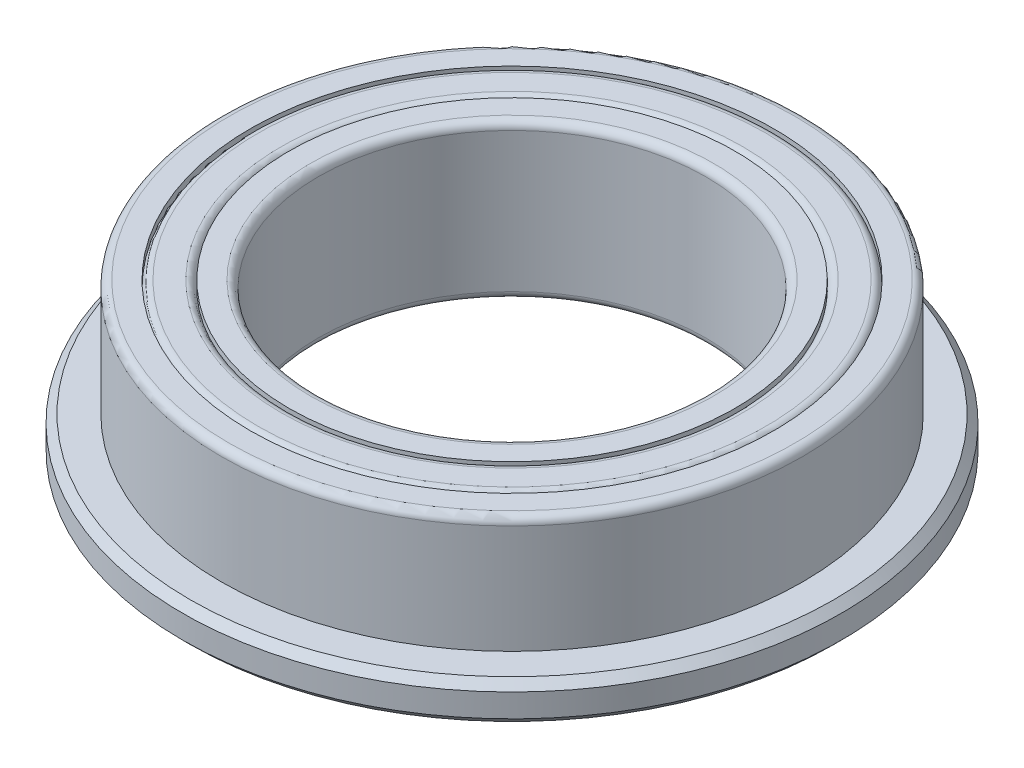
ISO-10303-21;
HEADER;
FILE_DESCRIPTION(('STEP AP214'),'2;1');
FILE_NAME('part.step','',(''),(''),'','','');
FILE_SCHEMA(('AUTOMOTIVE_DESIGN { 1 0 10303 214 1 1 1 1 }'));
ENDSEC;
DATA;
#1=APPLICATION_CONTEXT('core data for automotive mechanical design processes');
#2=APPLICATION_PROTOCOL_DEFINITION('international standard','automotive_design',2000,#1);
#3=PRODUCT_CONTEXT('',#1,'mechanical');
#4=PRODUCT('Part','Part','',(#3));
#5=PRODUCT_RELATED_PRODUCT_CATEGORY('part','',(#4));
#6=PRODUCT_DEFINITION_FORMATION('','',#4);
#7=PRODUCT_DEFINITION_CONTEXT('part definition',#1,'design');
#8=PRODUCT_DEFINITION('design','',#6,#7);
#9=PRODUCT_DEFINITION_SHAPE('','',#8);
#10=(LENGTH_UNIT() NAMED_UNIT(*) SI_UNIT(.MILLI.,.METRE.));
#11=(NAMED_UNIT(*) PLANE_ANGLE_UNIT() SI_UNIT($,.RADIAN.));
#12=(NAMED_UNIT(*) SI_UNIT($,.STERADIAN.) SOLID_ANGLE_UNIT());
#13=UNCERTAINTY_MEASURE_WITH_UNIT(LENGTH_MEASURE(1.E-05),#10,'distance_accuracy_value','');
#14=(GEOMETRIC_REPRESENTATION_CONTEXT(3) GLOBAL_UNCERTAINTY_ASSIGNED_CONTEXT((#13)) GLOBAL_UNIT_ASSIGNED_CONTEXT((#10,
#11,#12)) REPRESENTATION_CONTEXT('',''));
#15=CARTESIAN_POINT('',(0.,0.,0.));
#16=DIRECTION('',(0.,0.,1.));
#17=DIRECTION('',(1.,0.,0.));
#18=AXIS2_PLACEMENT_3D('',#15,#16,#17);
#19=CARTESIAN_POINT('',(0.,1.,0.));
#20=DIRECTION('',(0.,-1.,0.));
#21=DIRECTION('',(0.,0.,-1.));
#22=AXIS2_PLACEMENT_3D('',#19,#20,#21);
#23=CYLINDRICAL_SURFACE('',#22,7.5);
#24=CARTESIAN_POINT('',(0.,1.,0.));
#25=DIRECTION('',(0.,1.,0.));
#26=DIRECTION('',(0.,0.,1.));
#27=AXIS2_PLACEMENT_3D('',#24,#25,#26);
#28=CIRCLE('',#27,7.5);
#29=CARTESIAN_POINT('',(0.,1.,7.5));
#30=VERTEX_POINT('',#29);
#31=EDGE_CURVE('E76',#30,#30,#28,.T.);
#32=ORIENTED_EDGE('',*,*,#31,.T.);
#33=EDGE_LOOP('',(#32));
#34=FACE_BOUND('',#33,.T.);
#35=CARTESIAN_POINT('',(0.,0.,0.));
#36=DIRECTION('',(0.,1.,0.));
#37=DIRECTION('',(0.,0.,1.));
#38=AXIS2_PLACEMENT_3D('',#35,#36,#37);
#39=CIRCLE('',#38,7.5);
#40=CARTESIAN_POINT('',(0.,0.,7.5));
#41=VERTEX_POINT('',#40);
#42=EDGE_CURVE('E77',#41,#41,#39,.T.);
#43=ORIENTED_EDGE('',*,*,#42,.F.);
#44=EDGE_LOOP('',(#43));
#45=FACE_BOUND('',#44,.T.);
#46=ADVANCED_FACE('F55',(#34,#45),#23,.F.);
#47=CARTESIAN_POINT('',(0.,1.,0.));
#48=DIRECTION('',(0.,-1.,0.));
#49=DIRECTION('',(0.,0.,-1.));
#50=AXIS2_PLACEMENT_3D('',#47,#48,#49);
#51=CYLINDRICAL_SURFACE('',#50,8.5);
#52=CARTESIAN_POINT('',(0.,0.800000000000006,0.));
#53=DIRECTION('',(0.,1.,0.));
#54=DIRECTION('',(0.,0.,1.));
#55=AXIS2_PLACEMENT_3D('',#52,#53,#54);
#56=CIRCLE('',#55,8.5);
#57=CARTESIAN_POINT('',(0.,0.800000000000006,-8.5));
#58=VERTEX_POINT('',#57);
#59=EDGE_CURVE('E63',#58,#58,#56,.F.);
#60=ORIENTED_EDGE('',*,*,#59,.T.);
#61=EDGE_LOOP('',(#60));
#62=FACE_BOUND('',#61,.T.);
#63=CARTESIAN_POINT('',(0.,0.200000000000001,0.));
#64=DIRECTION('',(0.,1.,0.));
#65=DIRECTION('',(0.,0.,1.));
#66=AXIS2_PLACEMENT_3D('',#63,#64,#65);
#67=CIRCLE('',#66,8.5);
#68=CARTESIAN_POINT('',(0.,0.200000000000001,8.5));
#69=VERTEX_POINT('',#68);
#70=EDGE_CURVE('E67',#69,#69,#67,.T.);
#71=ORIENTED_EDGE('',*,*,#70,.T.);
#72=EDGE_LOOP('',(#71));
#73=FACE_BOUND('',#72,.T.);
#74=ADVANCED_FACE('F88',(#62,#73),#51,.T.);
#75=CARTESIAN_POINT('',(0.,1.,0.));
#76=DIRECTION('',(0.,1.,0.));
#77=DIRECTION('',(0.,0.,1.));
#78=AXIS2_PLACEMENT_3D('',#75,#76,#77);
#79=PLANE('',#78);
#80=CARTESIAN_POINT('',(0.,1.,0.));
#81=DIRECTION('',(0.,1.,0.));
#82=DIRECTION('',(0.,0.,1.));
#83=AXIS2_PLACEMENT_3D('',#80,#81,#82);
#84=CIRCLE('',#83,8.30000000000001);
#85=CARTESIAN_POINT('',(0.,1.,-8.30000000000001));
#86=VERTEX_POINT('',#85);
#87=EDGE_CURVE('E71',#86,#86,#84,.T.);
#88=ORIENTED_EDGE('',*,*,#87,.T.);
#89=EDGE_LOOP('',(#88));
#90=FACE_BOUND('',#89,.T.);
#91=ORIENTED_EDGE('',*,*,#31,.F.);
#92=EDGE_LOOP('',(#91));
#93=FACE_BOUND('',#92,.T.);
#94=ADVANCED_FACE('F85',(#90,#93),#79,.T.);
#95=CARTESIAN_POINT('',(0.,0.,0.));
#96=DIRECTION('',(0.,1.,0.));
#97=DIRECTION('',(0.,0.,1.));
#98=AXIS2_PLACEMENT_3D('',#95,#96,#97);
#99=PLANE('',#98);
#100=CARTESIAN_POINT('',(0.,0.,0.));
#101=DIRECTION('',(0.,1.,0.));
#102=DIRECTION('',(0.,0.,1.));
#103=AXIS2_PLACEMENT_3D('',#100,#101,#102);
#104=CIRCLE('',#103,8.3);
#105=CARTESIAN_POINT('',(0.,0.,8.3));
#106=VERTEX_POINT('',#105);
#107=EDGE_CURVE('E12',#106,#106,#104,.F.);
#108=ORIENTED_EDGE('',*,*,#107,.T.);
#109=EDGE_LOOP('',(#108));
#110=FACE_BOUND('',#109,.T.);
#111=ORIENTED_EDGE('',*,*,#42,.T.);
#112=EDGE_LOOP('',(#111));
#113=FACE_BOUND('',#112,.T.);
#114=ADVANCED_FACE('F87',(#110,#113),#99,.F.);
#115=CARTESIAN_POINT('',(0.,1.,0.));
#116=DIRECTION('',(0.,-1.,0.));
#117=DIRECTION('',(0.,0.,-1.));
#118=AXIS2_PLACEMENT_3D('',#115,#116,#117);
#119=CONICAL_SURFACE('',#118,8.30000000000001,0.785398163397444);
#120=CARTESIAN_POINT('',(0.,0.800000000000006,-8.5));
#121=CARTESIAN_POINT('',(0.,0.802083333333339,-8.49791666666667));
#122=CARTESIAN_POINT('',(0.,0.804166666666673,-8.49583333333333));
#123=CARTESIAN_POINT('',(0.,0.808333333333339,-8.49166666666667));
#124=CARTESIAN_POINT('',(0.,0.810416666666673,-8.48958333333334));
#125=CARTESIAN_POINT('',(0.,0.814583333333339,-8.48541666666667));
#126=CARTESIAN_POINT('',(0.,0.816666666666672,-8.48333333333333));
#127=CARTESIAN_POINT('',(0.,0.820833333333339,-8.47916666666667));
#128=CARTESIAN_POINT('',(0.,0.822916666666672,-8.47708333333333));
#129=CARTESIAN_POINT('',(0.,0.827083333333339,-8.47291666666667));
#130=CARTESIAN_POINT('',(0.,0.829166666666672,-8.47083333333333));
#131=CARTESIAN_POINT('',(0.,0.833333333333339,-8.46666666666667));
#132=CARTESIAN_POINT('',(0.,0.835416666666672,-8.46458333333334));
#133=CARTESIAN_POINT('',(0.,0.839583333333339,-8.46041666666667));
#134=CARTESIAN_POINT('',(0.,0.841666666666672,-8.45833333333334));
#135=CARTESIAN_POINT('',(0.,0.845833333333338,-8.45416666666667));
#136=CARTESIAN_POINT('',(0.,0.847916666666671,-8.45208333333334));
#137=CARTESIAN_POINT('',(0.,0.852083333333338,-8.44791666666667));
#138=CARTESIAN_POINT('',(0.,0.854166666666671,-8.44583333333334));
#139=CARTESIAN_POINT('',(0.,0.858333333333338,-8.44166666666667));
#140=CARTESIAN_POINT('',(0.,0.860416666666671,-8.43958333333334));
#141=CARTESIAN_POINT('',(0.,0.864583333333338,-8.43541666666667));
#142=CARTESIAN_POINT('',(0.,0.866666666666671,-8.43333333333334));
#143=CARTESIAN_POINT('',(0.,0.870833333333337,-8.42916666666667));
#144=CARTESIAN_POINT('',(0.,0.872916666666671,-8.42708333333334));
#145=CARTESIAN_POINT('',(0.,0.877083333333337,-8.42291666666667));
#146=CARTESIAN_POINT('',(0.,0.87916666666667,-8.42083333333334));
#147=CARTESIAN_POINT('',(0.,0.883333333333337,-8.41666666666667));
#148=CARTESIAN_POINT('',(0.,0.88541666666667,-8.41458333333334));
#149=CARTESIAN_POINT('',(0.,0.889583333333337,-8.41041666666667));
#150=CARTESIAN_POINT('',(0.,0.89166666666667,-8.40833333333334));
#151=CARTESIAN_POINT('',(0.,0.895833333333336,-8.40416666666667));
#152=CARTESIAN_POINT('',(0.,0.89791666666667,-8.40208333333334));
#153=CARTESIAN_POINT('',(0.,0.902083333333336,-8.39791666666667));
#154=CARTESIAN_POINT('',(0.,0.90416666666667,-8.39583333333334));
#155=CARTESIAN_POINT('',(0.,0.908333333333336,-8.39166666666667));
#156=CARTESIAN_POINT('',(0.,0.91041666666667,-8.38958333333334));
#157=CARTESIAN_POINT('',(0.,0.914583333333336,-8.38541666666667));
#158=CARTESIAN_POINT('',(0.,0.916666666666669,-8.38333333333334));
#159=CARTESIAN_POINT('',(0.,0.920833333333336,-8.37916666666667));
#160=CARTESIAN_POINT('',(0.,0.922916666666669,-8.37708333333334));
#161=CARTESIAN_POINT('',(0.,0.927083333333336,-8.37291666666667));
#162=CARTESIAN_POINT('',(0.,0.929166666666669,-8.37083333333334));
#163=CARTESIAN_POINT('',(0.,0.933333333333335,-8.36666666666667));
#164=CARTESIAN_POINT('',(0.,0.935416666666669,-8.36458333333334));
#165=CARTESIAN_POINT('',(0.,0.939583333333335,-8.36041666666667));
#166=CARTESIAN_POINT('',(0.,0.941666666666668,-8.35833333333334));
#167=CARTESIAN_POINT('',(0.,0.945833333333335,-8.35416666666667));
#168=CARTESIAN_POINT('',(0.,0.947916666666668,-8.35208333333334));
#169=CARTESIAN_POINT('',(0.,0.952083333333335,-8.34791666666667));
#170=CARTESIAN_POINT('',(0.,0.954166666666668,-8.34583333333334));
#171=CARTESIAN_POINT('',(0.,0.958333333333335,-8.34166666666667));
#172=CARTESIAN_POINT('',(0.,0.960416666666668,-8.33958333333334));
#173=CARTESIAN_POINT('',(0.,0.964583333333335,-8.33541666666667));
#174=CARTESIAN_POINT('',(0.,0.966666666666668,-8.33333333333334));
#175=CARTESIAN_POINT('',(0.,0.970833333333334,-8.32916666666667));
#176=CARTESIAN_POINT('',(0.,0.972916666666667,-8.32708333333334));
#177=CARTESIAN_POINT('',(0.,0.977083333333334,-8.32291666666667));
#178=CARTESIAN_POINT('',(0.,0.979166666666667,-8.32083333333334));
#179=CARTESIAN_POINT('',(0.,0.983333333333334,-8.31666666666668));
#180=CARTESIAN_POINT('',(0.,0.985416666666667,-8.31458333333334));
#181=CARTESIAN_POINT('',(0.,0.989583333333334,-8.31041666666668));
#182=CARTESIAN_POINT('',(0.,0.991666666666667,-8.30833333333334));
#183=CARTESIAN_POINT('',(0.,0.995833333333333,-8.30416666666667));
#184=CARTESIAN_POINT('',(0.,0.997916666666666,-8.30208333333334));
#185=CARTESIAN_POINT('',(0.,1.,-8.30000000000001));
#186=B_SPLINE_CURVE_WITH_KNOTS('',3,(#120,#121,#122,#123,#124,#125,#126,#127,#128,#129,#130,
#131,#132,#133,#134,#135,#136,#137,#138,#139,#140,#141,#142,#143,#144,#145,#146,#147,#148,#149,
#150,#151,#152,#153,#154,#155,#156,#157,#158,#159,#160,#161,#162,#163,#164,#165,#166,#167,#168,
#169,#170,#171,#172,#173,#174,#175,#176,#177,#178,#179,#180,#181,#182,#183,#184,#185),
.UNSPECIFIED.,.F.,.F.,(4,2,2,2,2,2,2,2,2,2,2,2,2,2,2,2,2,2,2,2,2,2,2,2,2,2,2,2,2,2,2,2,4),(0.,
0.00883883476483125,0.0176776695296624,0.0265165042944949,0.0353553390593261,0.0441941738241573,
0.0530330085889885,0.061871843353821,0.0707106781186522,0.0795495128834834,0.0883883476483146,
0.0972271824131471,0.106066017177978,0.11490485194281,0.123743686707641,0.132582521472473,
0.141421356237304,0.150260191002136,0.159099025766967,0.167937860531799,0.17677669529663,
0.185615530061462,0.194454364826293,0.203293199591125,0.212132034355957,0.220970869120788,
0.229809703885619,0.238648538650451,0.247487373415283,0.256326208180114,0.265165042944945,
0.274003877709777,0.282842712474609),.UNSPECIFIED.);
#187=EDGE_CURVE('BSEAM95',#58,#86,#186,.T.);
#188=ORIENTED_EDGE('',*,*,#59,.F.);
#189=ORIENTED_EDGE('',*,*,#87,.F.);
#190=ORIENTED_EDGE('',*,*,#187,.T.);
#191=ORIENTED_EDGE('',*,*,#187,.F.);
#192=EDGE_LOOP('',(#188,#190,#189,#191));
#193=FACE_BOUND('',#192,.T.);
#194=ADVANCED_FACE('F95',(#193),#119,.T.);
#195=CARTESIAN_POINT('',(0.,0.200000000000001,0.));
#196=DIRECTION('',(0.,1.,0.));
#197=DIRECTION('',(0.,0.,1.));
#198=AXIS2_PLACEMENT_3D('',#195,#196,#197);
#199=CONICAL_SURFACE('',#198,8.5,0.785398163397448);
#200=ORIENTED_EDGE('',*,*,#107,.F.);
#201=EDGE_LOOP('',(#200));
#202=FACE_BOUND('',#201,.T.);
#203=ORIENTED_EDGE('',*,*,#70,.F.);
#204=EDGE_LOOP('',(#203));
#205=FACE_BOUND('',#204,.T.);
#206=ADVANCED_FACE('F58',(#202,#205),#199,.T.);
#207=CLOSED_SHELL('',(#46,#74,#94,#114,#194,#206));
#208=MANIFOLD_SOLID_BREP('B2',#207);
#209=CARTESIAN_POINT('',(0.,4.,0.));
#210=DIRECTION('',(0.,-1.,0.));
#211=DIRECTION('',(0.,0.,-1.));
#212=AXIS2_PLACEMENT_3D('',#209,#210,#211);
#213=CYLINDRICAL_SURFACE('',#212,5.);
#214=CARTESIAN_POINT('',(0.,0.2,0.));
#215=DIRECTION('',(0.,1.,0.));
#216=DIRECTION('',(0.,0.,1.));
#217=AXIS2_PLACEMENT_3D('',#214,#215,#216);
#218=CIRCLE('',#217,5.);
#219=CARTESIAN_POINT('',(0.,0.2,5.));
#220=VERTEX_POINT('',#219);
#221=EDGE_CURVE('E167',#220,#220,#218,.F.);
#222=ORIENTED_EDGE('',*,*,#221,.T.);
#223=EDGE_LOOP('',(#222));
#224=FACE_BOUND('',#223,.T.);
#225=CARTESIAN_POINT('',(0.,3.8,0.));
#226=DIRECTION('',(0.,1.,0.));
#227=DIRECTION('',(0.,0.,1.));
#228=AXIS2_PLACEMENT_3D('',#225,#226,#227);
#229=CIRCLE('',#228,5.);
#230=CARTESIAN_POINT('',(0.,3.8,5.));
#231=VERTEX_POINT('',#230);
#232=EDGE_CURVE('E171',#231,#231,#229,.T.);
#233=ORIENTED_EDGE('',*,*,#232,.T.);
#234=EDGE_LOOP('',(#233));
#235=FACE_BOUND('',#234,.T.);
#236=ADVANCED_FACE('F160',(#224,#235),#213,.F.);
#237=CARTESIAN_POINT('',(0.,4.,0.));
#238=DIRECTION('',(0.,-1.,0.));
#239=DIRECTION('',(0.,0.,-1.));
#240=AXIS2_PLACEMENT_3D('',#237,#238,#239);
#241=CYLINDRICAL_SURFACE('',#240,5.75);
#242=CARTESIAN_POINT('',(0.,4.,0.));
#243=DIRECTION('',(0.,1.,0.));
#244=DIRECTION('',(0.,0.,1.));
#245=AXIS2_PLACEMENT_3D('',#242,#243,#244);
#246=CIRCLE('',#245,5.75);
#247=CARTESIAN_POINT('',(0.,4.,5.75));
#248=VERTEX_POINT('',#247);
#249=EDGE_CURVE('E180',#248,#248,#246,.T.);
#250=ORIENTED_EDGE('',*,*,#249,.F.);
#251=EDGE_LOOP('',(#250));
#252=FACE_BOUND('',#251,.T.);
#253=CARTESIAN_POINT('',(0.,0.,0.));
#254=DIRECTION('',(0.,1.,0.));
#255=DIRECTION('',(0.,0.,1.));
#256=AXIS2_PLACEMENT_3D('',#253,#254,#255);
#257=CIRCLE('',#256,5.75);
#258=CARTESIAN_POINT('',(0.,0.,5.75));
#259=VERTEX_POINT('',#258);
#260=EDGE_CURVE('E181',#259,#259,#257,.T.);
#261=ORIENTED_EDGE('',*,*,#260,.T.);
#262=EDGE_LOOP('',(#261));
#263=FACE_BOUND('',#262,.T.);
#264=ADVANCED_FACE('F189',(#252,#263),#241,.T.);
#265=CARTESIAN_POINT('',(0.,4.,0.));
#266=DIRECTION('',(0.,1.,0.));
#267=DIRECTION('',(0.,0.,1.));
#268=AXIS2_PLACEMENT_3D('',#265,#266,#267);
#269=PLANE('',#268);
#270=CARTESIAN_POINT('',(0.,4.,0.));
#271=DIRECTION('',(0.,1.,0.));
#272=DIRECTION('',(0.,0.,1.));
#273=AXIS2_PLACEMENT_3D('',#270,#271,#272);
#274=CIRCLE('',#273,5.2);
#275=CARTESIAN_POINT('',(0.,4.,5.2));
#276=VERTEX_POINT('',#275);
#277=EDGE_CURVE('E54',#276,#276,#274,.F.);
#278=ORIENTED_EDGE('',*,*,#277,.T.);
#279=EDGE_LOOP('',(#278));
#280=FACE_BOUND('',#279,.T.);
#281=ORIENTED_EDGE('',*,*,#249,.T.);
#282=EDGE_LOOP('',(#281));
#283=FACE_BOUND('',#282,.T.);
#284=ADVANCED_FACE('F187',(#280,#283),#269,.T.);
#285=CARTESIAN_POINT('',(0.,0.,0.));
#286=DIRECTION('',(0.,1.,0.));
#287=DIRECTION('',(0.,0.,1.));
#288=AXIS2_PLACEMENT_3D('',#285,#286,#287);
#289=PLANE('',#288);
#290=CARTESIAN_POINT('',(0.,0.,0.));
#291=DIRECTION('',(0.,1.,0.));
#292=DIRECTION('',(0.,0.,1.));
#293=AXIS2_PLACEMENT_3D('',#290,#291,#292);
#294=CIRCLE('',#293,5.2);
#295=CARTESIAN_POINT('',(0.,0.,5.2));
#296=VERTEX_POINT('',#295);
#297=EDGE_CURVE('E175',#296,#296,#294,.T.);
#298=ORIENTED_EDGE('',*,*,#297,.T.);
#299=EDGE_LOOP('',(#298));
#300=FACE_BOUND('',#299,.T.);
#301=ORIENTED_EDGE('',*,*,#260,.F.);
#302=EDGE_LOOP('',(#301));
#303=FACE_BOUND('',#302,.T.);
#304=ADVANCED_FACE('F195',(#300,#303),#289,.F.);
#305=CARTESIAN_POINT('',(0.,0.2,0.));
#306=DIRECTION('',(0.,1.,0.));
#307=DIRECTION('',(0.,0.,1.));
#308=AXIS2_PLACEMENT_3D('',#305,#306,#307);
#309=TOROIDAL_SURFACE('',#308,5.2,0.2);
#310=ORIENTED_EDGE('',*,*,#221,.F.);
#311=EDGE_LOOP('',(#310));
#312=FACE_BOUND('',#311,.T.);
#313=ORIENTED_EDGE('',*,*,#297,.F.);
#314=EDGE_LOOP('',(#313));
#315=FACE_BOUND('',#314,.T.);
#316=ADVANCED_FACE('F197',(#312,#315),#309,.T.);
#317=CARTESIAN_POINT('',(0.,3.8,0.));
#318=DIRECTION('',(0.,1.,0.));
#319=DIRECTION('',(0.,0.,1.));
#320=AXIS2_PLACEMENT_3D('',#317,#318,#319);
#321=TOROIDAL_SURFACE('',#320,5.2,0.2);
#322=ORIENTED_EDGE('',*,*,#277,.F.);
#323=EDGE_LOOP('',(#322));
#324=FACE_BOUND('',#323,.T.);
#325=ORIENTED_EDGE('',*,*,#232,.F.);
#326=EDGE_LOOP('',(#325));
#327=FACE_BOUND('',#326,.T.);
#328=ADVANCED_FACE('F162',(#324,#327),#321,.T.);
#329=CLOSED_SHELL('',(#236,#264,#284,#304,#316,#328));
#330=MANIFOLD_SOLID_BREP('B7',#329);
#331=CARTESIAN_POINT('',(0.,4.,0.));
#332=DIRECTION('',(0.,-1.,0.));
#333=DIRECTION('',(0.,0.,-1.));
#334=AXIS2_PLACEMENT_3D('',#331,#332,#333);
#335=CYLINDRICAL_SURFACE('',#334,6.75);
#336=CARTESIAN_POINT('',(0.,4.,0.));
#337=DIRECTION('',(0.,1.,0.));
#338=DIRECTION('',(0.,0.,1.));
#339=AXIS2_PLACEMENT_3D('',#336,#337,#338);
#340=CIRCLE('',#339,6.75);
#341=CARTESIAN_POINT('',(0.,4.,6.75));
#342=VERTEX_POINT('',#341);
#343=EDGE_CURVE('E269',#342,#342,#340,.T.);
#344=ORIENTED_EDGE('',*,*,#343,.T.);
#345=EDGE_LOOP('',(#344));
#346=FACE_BOUND('',#345,.T.);
#347=CARTESIAN_POINT('',(0.,0.,0.));
#348=DIRECTION('',(0.,1.,0.));
#349=DIRECTION('',(0.,0.,1.));
#350=AXIS2_PLACEMENT_3D('',#347,#348,#349);
#351=CIRCLE('',#350,6.75);
#352=CARTESIAN_POINT('',(0.,0.,6.75));
#353=VERTEX_POINT('',#352);
#354=EDGE_CURVE('E278',#353,#353,#351,.T.);
#355=ORIENTED_EDGE('',*,*,#354,.F.);
#356=EDGE_LOOP('',(#355));
#357=FACE_BOUND('',#356,.T.);
#358=ADVANCED_FACE('F258',(#346,#357),#335,.F.);
#359=CARTESIAN_POINT('',(0.,4.,0.));
#360=DIRECTION('',(0.,-1.,0.));
#361=DIRECTION('',(0.,0.,-1.));
#362=AXIS2_PLACEMENT_3D('',#359,#360,#361);
#363=CYLINDRICAL_SURFACE('',#362,7.5);
#364=CARTESIAN_POINT('',(0.,3.8,0.));
#365=DIRECTION('',(0.,1.,0.));
#366=DIRECTION('',(0.,0.,1.));
#367=AXIS2_PLACEMENT_3D('',#364,#365,#366);
#368=CIRCLE('',#367,7.5);
#369=CARTESIAN_POINT('',(0.,3.8,7.5));
#370=VERTEX_POINT('',#369);
#371=EDGE_CURVE('E159',#370,#370,#368,.F.);
#372=ORIENTED_EDGE('',*,*,#371,.T.);
#373=EDGE_LOOP('',(#372));
#374=FACE_BOUND('',#373,.T.);
#375=CARTESIAN_POINT('',(0.,0.,0.));
#376=DIRECTION('',(0.,1.,0.));
#377=DIRECTION('',(0.,0.,1.));
#378=AXIS2_PLACEMENT_3D('',#375,#376,#377);
#379=CIRCLE('',#378,7.5);
#380=CARTESIAN_POINT('',(0.,0.,7.5));
#381=VERTEX_POINT('',#380);
#382=EDGE_CURVE('E273',#381,#381,#379,.T.);
#383=ORIENTED_EDGE('',*,*,#382,.T.);
#384=EDGE_LOOP('',(#383));
#385=FACE_BOUND('',#384,.T.);
#386=ADVANCED_FACE('F286',(#374,#385),#363,.T.);
#387=CARTESIAN_POINT('',(0.,4.,0.));
#388=DIRECTION('',(0.,1.,0.));
#389=DIRECTION('',(0.,0.,1.));
#390=AXIS2_PLACEMENT_3D('',#387,#388,#389);
#391=PLANE('',#390);
#392=CARTESIAN_POINT('',(0.,4.,0.));
#393=DIRECTION('',(0.,1.,0.));
#394=DIRECTION('',(0.,0.,1.));
#395=AXIS2_PLACEMENT_3D('',#392,#393,#394);
#396=CIRCLE('',#395,7.3);
#397=CARTESIAN_POINT('',(0.,4.,7.3));
#398=VERTEX_POINT('',#397);
#399=EDGE_CURVE('E265',#398,#398,#396,.T.);
#400=ORIENTED_EDGE('',*,*,#399,.T.);
#401=EDGE_LOOP('',(#400));
#402=FACE_BOUND('',#401,.T.);
#403=ORIENTED_EDGE('',*,*,#343,.F.);
#404=EDGE_LOOP('',(#403));
#405=FACE_BOUND('',#404,.T.);
#406=ADVANCED_FACE('F291',(#402,#405),#391,.T.);
#407=CARTESIAN_POINT('',(0.,0.,0.));
#408=DIRECTION('',(0.,1.,0.));
#409=DIRECTION('',(0.,0.,1.));
#410=AXIS2_PLACEMENT_3D('',#407,#408,#409);
#411=PLANE('',#410);
#412=ORIENTED_EDGE('',*,*,#354,.T.);
#413=EDGE_LOOP('',(#412));
#414=FACE_BOUND('',#413,.T.);
#415=ORIENTED_EDGE('',*,*,#382,.F.);
#416=EDGE_LOOP('',(#415));
#417=FACE_BOUND('',#416,.T.);
#418=ADVANCED_FACE('F282',(#414,#417),#411,.F.);
#419=CARTESIAN_POINT('',(0.,3.8,0.));
#420=DIRECTION('',(0.,1.,0.));
#421=DIRECTION('',(0.,0.,1.));
#422=AXIS2_PLACEMENT_3D('',#419,#420,#421);
#423=TOROIDAL_SURFACE('',#422,7.3,0.2);
#424=ORIENTED_EDGE('',*,*,#371,.F.);
#425=EDGE_LOOP('',(#424));
#426=FACE_BOUND('',#425,.T.);
#427=ORIENTED_EDGE('',*,*,#399,.F.);
#428=EDGE_LOOP('',(#427));
#429=FACE_BOUND('',#428,.T.);
#430=ADVANCED_FACE('F260',(#426,#429),#423,.T.);
#431=CLOSED_SHELL('',(#358,#386,#406,#418,#430));
#432=MANIFOLD_SOLID_BREP('B49',#431);
#433=CARTESIAN_POINT('',(0.,4.,0.));
#434=DIRECTION('',(0.,-1.,0.));
#435=DIRECTION('',(0.,0.,-1.));
#436=AXIS2_PLACEMENT_3D('',#433,#434,#435);
#437=CYLINDRICAL_SURFACE('',#436,5.75);
#438=CARTESIAN_POINT('',(0.,0.2,0.));
#439=DIRECTION('',(0.,1.,0.));
#440=DIRECTION('',(0.,0.,1.));
#441=AXIS2_PLACEMENT_3D('',#438,#439,#440);
#442=CIRCLE('',#441,5.75);
#443=CARTESIAN_POINT('',(0.,0.2,5.75));
#444=VERTEX_POINT('',#443);
#445=EDGE_CURVE('E345',#444,#444,#442,.F.);
#446=ORIENTED_EDGE('',*,*,#445,.T.);
#447=EDGE_LOOP('',(#446));
#448=FACE_BOUND('',#447,.T.);
#449=CARTESIAN_POINT('',(0.,3.8,0.));
#450=DIRECTION('',(0.,1.,0.));
#451=DIRECTION('',(0.,0.,1.));
#452=AXIS2_PLACEMENT_3D('',#449,#450,#451);
#453=CIRCLE('',#452,5.75);
#454=CARTESIAN_POINT('',(0.,3.8,5.75));
#455=VERTEX_POINT('',#454);
#456=EDGE_CURVE('E349',#455,#455,#453,.T.);
#457=ORIENTED_EDGE('',*,*,#456,.T.);
#458=EDGE_LOOP('',(#457));
#459=FACE_BOUND('',#458,.T.);
#460=ADVANCED_FACE('F334',(#448,#459),#437,.F.);
#461=CARTESIAN_POINT('',(0.,4.,0.));
#462=DIRECTION('',(0.,-1.,0.));
#463=DIRECTION('',(0.,0.,-1.));
#464=AXIS2_PLACEMENT_3D('',#461,#462,#463);
#465=CYLINDRICAL_SURFACE('',#464,6.75);
#466=CARTESIAN_POINT('',(0.,0.2,0.));
#467=DIRECTION('',(0.,1.,0.));
#468=DIRECTION('',(0.,0.,1.));
#469=AXIS2_PLACEMENT_3D('',#466,#467,#468);
#470=CIRCLE('',#469,6.75);
#471=CARTESIAN_POINT('',(0.,0.2,6.75));
#472=VERTEX_POINT('',#471);
#473=EDGE_CURVE('E360',#472,#472,#470,.T.);
#474=ORIENTED_EDGE('',*,*,#473,.T.);
#475=EDGE_LOOP('',(#474));
#476=FACE_BOUND('',#475,.T.);
#477=CARTESIAN_POINT('',(0.,3.8,0.));
#478=DIRECTION('',(0.,1.,0.));
#479=DIRECTION('',(0.,0.,1.));
#480=AXIS2_PLACEMENT_3D('',#477,#478,#479);
#481=CIRCLE('',#480,6.75);
#482=CARTESIAN_POINT('',(0.,3.8,6.75));
#483=VERTEX_POINT('',#482);
#484=EDGE_CURVE('E363',#483,#483,#481,.F.);
#485=ORIENTED_EDGE('',*,*,#484,.T.);
#486=EDGE_LOOP('',(#485));
#487=FACE_BOUND('',#486,.T.);
#488=ADVANCED_FACE('F367',(#476,#487),#465,.T.);
#489=CARTESIAN_POINT('',(0.,4.,0.));
#490=DIRECTION('',(0.,1.,0.));
#491=DIRECTION('',(0.,0.,1.));
#492=AXIS2_PLACEMENT_3D('',#489,#490,#491);
#493=PLANE('',#492);
#494=CARTESIAN_POINT('',(0.,4.,0.));
#495=DIRECTION('',(0.,1.,0.));
#496=DIRECTION('',(0.,0.,1.));
#497=AXIS2_PLACEMENT_3D('',#494,#495,#496);
#498=CIRCLE('',#497,6.55);
#499=CARTESIAN_POINT('',(0.,4.,6.55));
#500=VERTEX_POINT('',#499);
#501=EDGE_CURVE('E257',#500,#500,#498,.T.);
#502=ORIENTED_EDGE('',*,*,#501,.T.);
#503=EDGE_LOOP('',(#502));
#504=FACE_BOUND('',#503,.T.);
#505=CARTESIAN_POINT('',(0.,4.,0.));
#506=DIRECTION('',(0.,1.,0.));
#507=DIRECTION('',(0.,0.,1.));
#508=AXIS2_PLACEMENT_3D('',#505,#506,#507);
#509=CIRCLE('',#508,5.95);
#510=CARTESIAN_POINT('',(0.,4.,5.95));
#511=VERTEX_POINT('',#510);
#512=EDGE_CURVE('E341',#511,#511,#509,.F.);
#513=ORIENTED_EDGE('',*,*,#512,.T.);
#514=EDGE_LOOP('',(#513));
#515=FACE_BOUND('',#514,.T.);
#516=ADVANCED_FACE('F387',(#504,#515),#493,.T.);
#517=CARTESIAN_POINT('',(0.,0.,0.));
#518=DIRECTION('',(0.,1.,0.));
#519=DIRECTION('',(0.,0.,1.));
#520=AXIS2_PLACEMENT_3D('',#517,#518,#519);
#521=PLANE('',#520);
#522=CARTESIAN_POINT('',(0.,0.,0.));
#523=DIRECTION('',(0.,1.,0.));
#524=DIRECTION('',(0.,0.,1.));
#525=AXIS2_PLACEMENT_3D('',#522,#523,#524);
#526=CIRCLE('',#525,6.55);
#527=CARTESIAN_POINT('',(0.,0.,6.55));
#528=VERTEX_POINT('',#527);
#529=EDGE_CURVE('E354',#528,#528,#526,.F.);
#530=ORIENTED_EDGE('',*,*,#529,.T.);
#531=EDGE_LOOP('',(#530));
#532=FACE_BOUND('',#531,.T.);
#533=CARTESIAN_POINT('',(0.,0.,0.));
#534=DIRECTION('',(0.,1.,0.));
#535=DIRECTION('',(0.,0.,1.));
#536=AXIS2_PLACEMENT_3D('',#533,#534,#535);
#537=CIRCLE('',#536,5.95);
#538=CARTESIAN_POINT('',(0.,0.,5.95));
#539=VERTEX_POINT('',#538);
#540=EDGE_CURVE('E357',#539,#539,#537,.T.);
#541=ORIENTED_EDGE('',*,*,#540,.T.);
#542=EDGE_LOOP('',(#541));
#543=FACE_BOUND('',#542,.T.);
#544=ADVANCED_FACE('F394',(#532,#543),#521,.F.);
#545=CARTESIAN_POINT('',(0.,0.2,0.));
#546=DIRECTION('',(0.,1.,0.));
#547=DIRECTION('',(0.,0.,1.));
#548=AXIS2_PLACEMENT_3D('',#545,#546,#547);
#549=TOROIDAL_SURFACE('',#548,6.55,0.2);
#550=ORIENTED_EDGE('',*,*,#529,.F.);
#551=EDGE_LOOP('',(#550));
#552=FACE_BOUND('',#551,.T.);
#553=ORIENTED_EDGE('',*,*,#473,.F.);
#554=EDGE_LOOP('',(#553));
#555=FACE_BOUND('',#554,.T.);
#556=ADVANCED_FACE('F378',(#552,#555),#549,.T.);
#557=CARTESIAN_POINT('',(0.,0.2,0.));
#558=DIRECTION('',(0.,1.,0.));
#559=DIRECTION('',(0.,0.,1.));
#560=AXIS2_PLACEMENT_3D('',#557,#558,#559);
#561=TOROIDAL_SURFACE('',#560,5.95,0.2);
#562=ORIENTED_EDGE('',*,*,#445,.F.);
#563=EDGE_LOOP('',(#562));
#564=FACE_BOUND('',#563,.T.);
#565=ORIENTED_EDGE('',*,*,#540,.F.);
#566=EDGE_LOOP('',(#565));
#567=FACE_BOUND('',#566,.T.);
#568=ADVANCED_FACE('F372',(#564,#567),#561,.T.);
#569=CARTESIAN_POINT('',(0.,3.8,0.));
#570=DIRECTION('',(0.,1.,0.));
#571=DIRECTION('',(0.,0.,1.));
#572=AXIS2_PLACEMENT_3D('',#569,#570,#571);
#573=TOROIDAL_SURFACE('',#572,6.55,0.2);
#574=ORIENTED_EDGE('',*,*,#484,.F.);
#575=EDGE_LOOP('',(#574));
#576=FACE_BOUND('',#575,.T.);
#577=ORIENTED_EDGE('',*,*,#501,.F.);
#578=EDGE_LOOP('',(#577));
#579=FACE_BOUND('',#578,.T.);
#580=ADVANCED_FACE('F369',(#576,#579),#573,.T.);
#581=CARTESIAN_POINT('',(0.,3.8,0.));
#582=DIRECTION('',(0.,1.,0.));
#583=DIRECTION('',(0.,0.,1.));
#584=AXIS2_PLACEMENT_3D('',#581,#582,#583);
#585=TOROIDAL_SURFACE('',#584,5.95,0.2);
#586=ORIENTED_EDGE('',*,*,#512,.F.);
#587=EDGE_LOOP('',(#586));
#588=FACE_BOUND('',#587,.T.);
#589=ORIENTED_EDGE('',*,*,#456,.F.);
#590=EDGE_LOOP('',(#589));
#591=FACE_BOUND('',#590,.T.);
#592=ADVANCED_FACE('F336',(#588,#591),#585,.T.);
#593=CLOSED_SHELL('',(#460,#488,#516,#544,#556,#568,#580,#592));
#594=MANIFOLD_SOLID_BREP('B154',#593);
#595=ADVANCED_BREP_SHAPE_REPRESENTATION('',(#18,#208,#330,#432,#594),#14);
#596=SHAPE_DEFINITION_REPRESENTATION(#9,#595);
ENDSEC;
END-ISO-10303-21;
